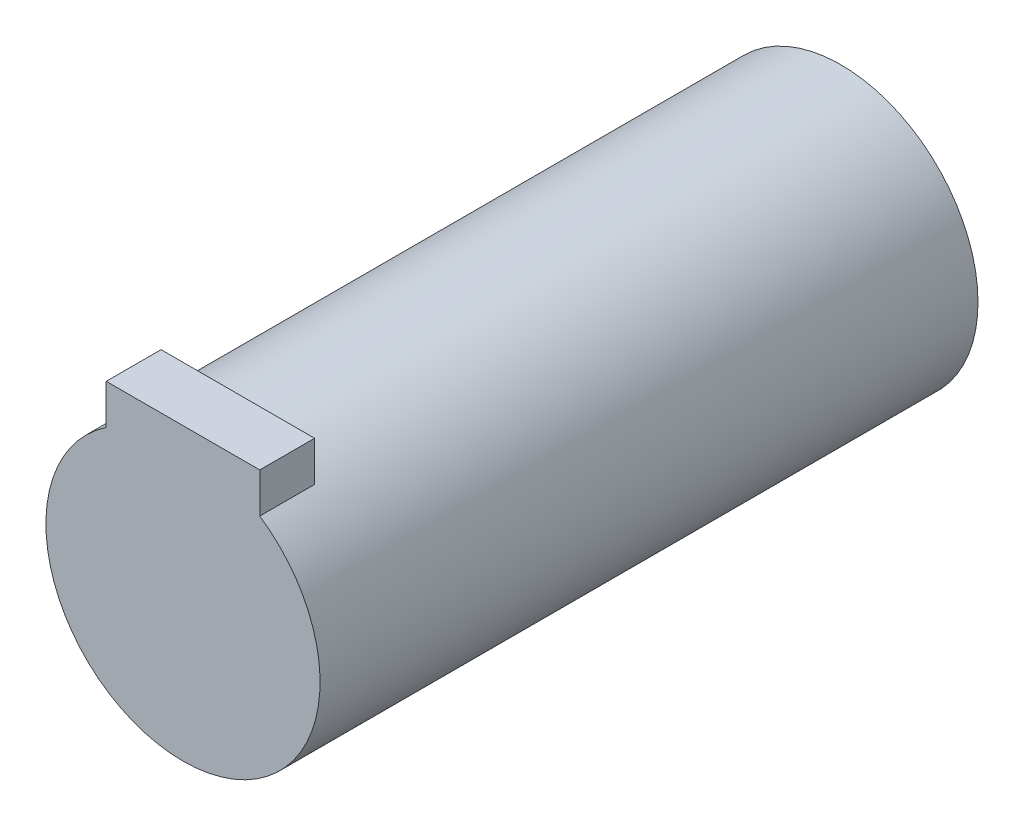
ISO-10303-21;
HEADER;
FILE_DESCRIPTION(('STEP AP214'),'2;1');
FILE_NAME('part.step','',(''),(''),'','','');
FILE_SCHEMA(('AUTOMOTIVE_DESIGN { 1 0 10303 214 1 1 1 1 }'));
ENDSEC;
DATA;
#1=APPLICATION_CONTEXT('core data for automotive mechanical design processes');
#2=APPLICATION_PROTOCOL_DEFINITION('international standard','automotive_design',2000,#1);
#3=PRODUCT_CONTEXT('',#1,'mechanical');
#4=PRODUCT('Part','Part','',(#3));
#5=PRODUCT_RELATED_PRODUCT_CATEGORY('part','',(#4));
#6=PRODUCT_DEFINITION_FORMATION('','',#4);
#7=PRODUCT_DEFINITION_CONTEXT('part definition',#1,'design');
#8=PRODUCT_DEFINITION('design','',#6,#7);
#9=PRODUCT_DEFINITION_SHAPE('','',#8);
#10=(LENGTH_UNIT() NAMED_UNIT(*) SI_UNIT(.MILLI.,.METRE.));
#11=(NAMED_UNIT(*) PLANE_ANGLE_UNIT() SI_UNIT($,.RADIAN.));
#12=(NAMED_UNIT(*) SI_UNIT($,.STERADIAN.) SOLID_ANGLE_UNIT());
#13=UNCERTAINTY_MEASURE_WITH_UNIT(LENGTH_MEASURE(1.E-05),#10,'distance_accuracy_value','');
#14=(GEOMETRIC_REPRESENTATION_CONTEXT(3) GLOBAL_UNCERTAINTY_ASSIGNED_CONTEXT((#13)) GLOBAL_UNIT_ASSIGNED_CONTEXT((#10,
#11,#12)) REPRESENTATION_CONTEXT('',''));
#15=CARTESIAN_POINT('',(0.,0.,0.));
#16=DIRECTION('',(0.,0.,1.));
#17=DIRECTION('',(1.,0.,0.));
#18=AXIS2_PLACEMENT_3D('',#15,#16,#17);
#19=CARTESIAN_POINT('',(0.,0.,60.));
#20=DIRECTION('',(0.,0.,-1.));
#21=DIRECTION('',(-1.,0.,0.));
#22=AXIS2_PLACEMENT_3D('',#19,#20,#21);
#23=CYLINDRICAL_SURFACE('',#22,12.5);
#24=CARTESIAN_POINT('',(0.,0.,0.));
#25=DIRECTION('',(0.,0.,1.));
#26=DIRECTION('',(1.,0.,0.));
#27=AXIS2_PLACEMENT_3D('',#24,#25,#26);
#28=CIRCLE('',#27,12.5);
#29=CARTESIAN_POINT('',(12.5,0.,0.));
#30=VERTEX_POINT('',#29);
#31=EDGE_CURVE('E105',#30,#30,#28,.T.);
#32=ORIENTED_EDGE('',*,*,#31,.T.);
#33=EDGE_LOOP('',(#32));
#34=FACE_BOUND('',#33,.T.);
#35=DIRECTION('',(0.,0.,-1.));
#36=VECTOR('',#35,1.);
#37=CARTESIAN_POINT('',(-6.99999999999999,10.356157588604,60.));
#38=LINE('',#37,#36);
#39=CARTESIAN_POINT('',(-7.,10.356157588604,55.));
#40=VERTEX_POINT('',#39);
#41=CARTESIAN_POINT('',(-6.99999999999999,10.356157588604,60.));
#42=VERTEX_POINT('',#41);
#43=EDGE_CURVE('E96',#40,#42,#38,.F.);
#44=ORIENTED_EDGE('',*,*,#43,.F.);
#45=CARTESIAN_POINT('',(0.,0.,55.));
#46=DIRECTION('',(0.,0.,1.));
#47=DIRECTION('',(1.,0.,0.));
#48=AXIS2_PLACEMENT_3D('',#45,#46,#47);
#49=CIRCLE('',#48,12.5);
#50=CARTESIAN_POINT('',(7.,10.356157588604,55.));
#51=VERTEX_POINT('',#50);
#52=EDGE_CURVE('E11',#51,#40,#49,.T.);
#53=ORIENTED_EDGE('',*,*,#52,.F.);
#54=DIRECTION('',(0.,0.,-1.));
#55=VECTOR('',#54,1.);
#56=CARTESIAN_POINT('',(7.,10.356157588604,60.));
#57=LINE('',#56,#55);
#58=CARTESIAN_POINT('',(7.,10.356157588604,60.));
#59=VERTEX_POINT('',#58);
#60=EDGE_CURVE('E97',#59,#51,#57,.T.);
#61=ORIENTED_EDGE('',*,*,#60,.F.);
#62=CARTESIAN_POINT('',(0.,0.,60.));
#63=DIRECTION('',(0.,0.,1.));
#64=DIRECTION('',(1.,0.,0.));
#65=AXIS2_PLACEMENT_3D('',#62,#63,#64);
#66=CIRCLE('',#65,12.5);
#67=EDGE_CURVE('E46',#42,#59,#66,.T.);
#68=ORIENTED_EDGE('',*,*,#67,.F.);
#69=EDGE_LOOP('',(#44,#53,#61,#68));
#70=FACE_BOUND('',#69,.T.);
#71=ADVANCED_FACE('F39',(#34,#70),#23,.T.);
#72=CARTESIAN_POINT('',(0.,0.,60.));
#73=DIRECTION('',(0.,0.,1.));
#74=DIRECTION('',(1.,0.,0.));
#75=AXIS2_PLACEMENT_3D('',#72,#73,#74);
#76=PLANE('',#75);
#77=ORIENTED_EDGE('',*,*,#67,.T.);
#78=DIRECTION('',(0.,-1.,0.));
#79=VECTOR('',#78,1.);
#80=CARTESIAN_POINT('',(7.,14.,60.));
#81=LINE('',#80,#79);
#82=CARTESIAN_POINT('',(7.,14.,60.));
#83=VERTEX_POINT('',#82);
#84=EDGE_CURVE('E81',#83,#59,#81,.T.);
#85=ORIENTED_EDGE('',*,*,#84,.F.);
#86=DIRECTION('',(1.,0.,0.));
#87=VECTOR('',#86,1.);
#88=CARTESIAN_POINT('',(-6.99999999999999,14.,60.));
#89=LINE('',#88,#87);
#90=CARTESIAN_POINT('',(-6.99999999999999,14.,60.));
#91=VERTEX_POINT('',#90);
#92=EDGE_CURVE('E75',#91,#83,#89,.T.);
#93=ORIENTED_EDGE('',*,*,#92,.F.);
#94=DIRECTION('',(0.,-1.,0.));
#95=VECTOR('',#94,1.);
#96=CARTESIAN_POINT('',(-6.99999999999999,14.,60.));
#97=LINE('',#96,#95);
#98=EDGE_CURVE('E79',#91,#42,#97,.T.);
#99=ORIENTED_EDGE('',*,*,#98,.T.);
#100=EDGE_LOOP('',(#77,#85,#93,#99));
#101=FACE_BOUND('',#100,.T.);
#102=ADVANCED_FACE('F77',(#101),#76,.T.);
#103=CARTESIAN_POINT('',(0.,0.,0.));
#104=DIRECTION('',(0.,0.,1.));
#105=DIRECTION('',(1.,0.,0.));
#106=AXIS2_PLACEMENT_3D('',#103,#104,#105);
#107=PLANE('',#106);
#108=ORIENTED_EDGE('',*,*,#31,.F.);
#109=EDGE_LOOP('',(#108));
#110=FACE_BOUND('',#109,.T.);
#111=ADVANCED_FACE('F110',(#110),#107,.F.);
#112=CARTESIAN_POINT('',(-6.99999999999999,14.,60.));
#113=DIRECTION('',(1.,0.,0.));
#114=DIRECTION('',(0.,0.,-1.));
#115=AXIS2_PLACEMENT_3D('',#112,#113,#114);
#116=PLANE('',#115);
#117=DIRECTION('',(0.,-1.,0.));
#118=VECTOR('',#117,1.);
#119=CARTESIAN_POINT('',(-7.,14.,55.));
#120=LINE('',#119,#118);
#121=CARTESIAN_POINT('',(-7.,14.,55.));
#122=VERTEX_POINT('',#121);
#123=EDGE_CURVE('E165',#122,#40,#120,.T.);
#124=ORIENTED_EDGE('',*,*,#123,.T.);
#125=ORIENTED_EDGE('',*,*,#43,.T.);
#126=ORIENTED_EDGE('',*,*,#98,.F.);
#127=DIRECTION('',(0.,0.,1.));
#128=VECTOR('',#127,1.);
#129=CARTESIAN_POINT('',(-6.99999999999999,14.,60.));
#130=LINE('',#129,#128);
#131=EDGE_CURVE('E85',#122,#91,#130,.T.);
#132=ORIENTED_EDGE('',*,*,#131,.F.);
#133=EDGE_LOOP('',(#124,#125,#126,#132));
#134=FACE_BOUND('',#133,.T.);
#135=ADVANCED_FACE('F95',(#134),#116,.F.);
#136=CARTESIAN_POINT('',(7.,14.,60.));
#137=DIRECTION('',(-1.,0.,0.));
#138=DIRECTION('',(0.,0.,1.));
#139=AXIS2_PLACEMENT_3D('',#136,#137,#138);
#140=PLANE('',#139);
#141=ORIENTED_EDGE('',*,*,#84,.T.);
#142=ORIENTED_EDGE('',*,*,#60,.T.);
#143=DIRECTION('',(0.,-1.,0.));
#144=VECTOR('',#143,1.);
#145=CARTESIAN_POINT('',(7.,14.,55.));
#146=LINE('',#145,#144);
#147=CARTESIAN_POINT('',(7.,14.,55.));
#148=VERTEX_POINT('',#147);
#149=EDGE_CURVE('E100',#148,#51,#146,.T.);
#150=ORIENTED_EDGE('',*,*,#149,.F.);
#151=DIRECTION('',(0.,0.,-1.));
#152=VECTOR('',#151,1.);
#153=CARTESIAN_POINT('',(7.,14.,60.));
#154=LINE('',#153,#152);
#155=EDGE_CURVE('E84',#83,#148,#154,.T.);
#156=ORIENTED_EDGE('',*,*,#155,.F.);
#157=EDGE_LOOP('',(#141,#142,#150,#156));
#158=FACE_BOUND('',#157,.T.);
#159=ADVANCED_FACE('F116',(#158),#140,.F.);
#160=CARTESIAN_POINT('',(-7.,14.,55.));
#161=DIRECTION('',(0.,0.,1.));
#162=DIRECTION('',(1.,0.,0.));
#163=AXIS2_PLACEMENT_3D('',#160,#161,#162);
#164=PLANE('',#163);
#165=ORIENTED_EDGE('',*,*,#149,.T.);
#166=ORIENTED_EDGE('',*,*,#52,.T.);
#167=ORIENTED_EDGE('',*,*,#123,.F.);
#168=DIRECTION('',(-1.,0.,0.));
#169=VECTOR('',#168,1.);
#170=CARTESIAN_POINT('',(-7.,14.,55.));
#171=LINE('',#170,#169);
#172=EDGE_CURVE('E90',#148,#122,#171,.T.);
#173=ORIENTED_EDGE('',*,*,#172,.F.);
#174=EDGE_LOOP('',(#165,#166,#167,#173));
#175=FACE_BOUND('',#174,.T.);
#176=ADVANCED_FACE('F139',(#175),#164,.F.);
#177=CARTESIAN_POINT('',(0.,14.,0.));
#178=DIRECTION('',(0.,-1.,0.));
#179=DIRECTION('',(0.,0.,-1.));
#180=AXIS2_PLACEMENT_3D('',#177,#178,#179);
#181=PLANE('',#180);
#182=ORIENTED_EDGE('',*,*,#131,.T.);
#183=ORIENTED_EDGE('',*,*,#92,.T.);
#184=ORIENTED_EDGE('',*,*,#155,.T.);
#185=ORIENTED_EDGE('',*,*,#172,.T.);
#186=EDGE_LOOP('',(#182,#183,#184,#185));
#187=FACE_BOUND('',#186,.T.);
#188=ADVANCED_FACE('F88',(#187),#181,.F.);
#189=CLOSED_SHELL('',(#71,#102,#111,#135,#159,#176,#188));
#190=MANIFOLD_SOLID_BREP('B2',#189);
#191=ADVANCED_BREP_SHAPE_REPRESENTATION('',(#18,#190),#14);
#192=SHAPE_DEFINITION_REPRESENTATION(#9,#191);
ENDSEC;
END-ISO-10303-21;
